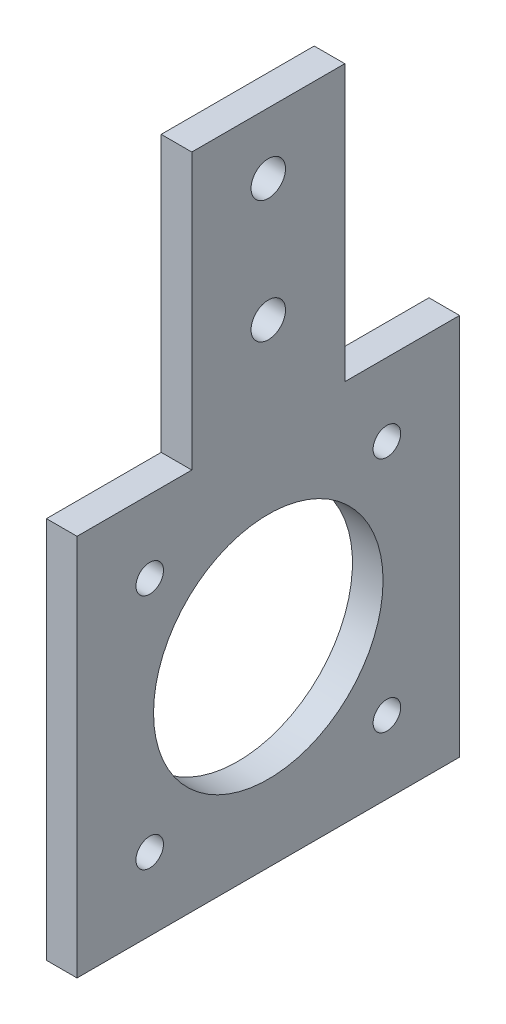
ISO-10303-21;
HEADER;
FILE_DESCRIPTION(('STEP AP214'),'2;1');
FILE_NAME('part.step','',(''),(''),'','','');
FILE_SCHEMA(('AUTOMOTIVE_DESIGN { 1 0 10303 214 1 1 1 1 }'));
ENDSEC;
DATA;
#1=APPLICATION_CONTEXT('core data for automotive mechanical design processes');
#2=APPLICATION_PROTOCOL_DEFINITION('international standard','automotive_design',2000,#1);
#3=PRODUCT_CONTEXT('',#1,'mechanical');
#4=PRODUCT('Part','Part','',(#3));
#5=PRODUCT_RELATED_PRODUCT_CATEGORY('part','',(#4));
#6=PRODUCT_DEFINITION_FORMATION('','',#4);
#7=PRODUCT_DEFINITION_CONTEXT('part definition',#1,'design');
#8=PRODUCT_DEFINITION('design','',#6,#7);
#9=PRODUCT_DEFINITION_SHAPE('','',#8);
#10=(LENGTH_UNIT() NAMED_UNIT(*) SI_UNIT(.MILLI.,.METRE.));
#11=(NAMED_UNIT(*) PLANE_ANGLE_UNIT() SI_UNIT($,.RADIAN.));
#12=(NAMED_UNIT(*) SI_UNIT($,.STERADIAN.) SOLID_ANGLE_UNIT());
#13=UNCERTAINTY_MEASURE_WITH_UNIT(LENGTH_MEASURE(1.E-05),#10,'distance_accuracy_value','');
#14=(GEOMETRIC_REPRESENTATION_CONTEXT(3) GLOBAL_UNCERTAINTY_ASSIGNED_CONTEXT((#13)) GLOBAL_UNIT_ASSIGNED_CONTEXT((#10,
#11,#12)) REPRESENTATION_CONTEXT('',''));
#15=CARTESIAN_POINT('',(0.,0.,0.));
#16=DIRECTION('',(0.,0.,1.));
#17=DIRECTION('',(1.,0.,0.));
#18=AXIS2_PLACEMENT_3D('',#15,#16,#17);
#19=CARTESIAN_POINT('',(-14.,40.,-14.));
#20=DIRECTION('',(1.,0.,0.));
#21=DIRECTION('',(0.,0.,-1.));
#22=AXIS2_PLACEMENT_3D('',#19,#20,#21);
#23=PLANE('',#22);
#24=CARTESIAN_POINT('',(-14.,-5.50021935639087,-15.4997806436091));
#25=DIRECTION('',(-1.,0.,0.));
#26=DIRECTION('',(0.,0.,1.));
#27=AXIS2_PLACEMENT_3D('',#24,#25,#26);
#28=CIRCLE('',#27,1.8);
#29=CARTESIAN_POINT('',(-14.,-5.50021935639087,-13.6997806436091));
#30=VERTEX_POINT('',#29);
#31=EDGE_CURVE('E151',#30,#30,#28,.T.);
#32=ORIENTED_EDGE('',*,*,#31,.F.);
#33=EDGE_LOOP('',(#32));
#34=FACE_BOUND('',#33,.T.);
#35=CARTESIAN_POINT('',(-14.,-5.50021935639087,15.4997806436091));
#36=DIRECTION('',(-1.,0.,0.));
#37=DIRECTION('',(0.,0.,1.));
#38=AXIS2_PLACEMENT_3D('',#35,#36,#37);
#39=CIRCLE('',#38,1.8);
#40=CARTESIAN_POINT('',(-14.,-5.50021935639087,17.2997806436091));
#41=VERTEX_POINT('',#40);
#42=EDGE_CURVE('E156',#41,#41,#39,.T.);
#43=ORIENTED_EDGE('',*,*,#42,.F.);
#44=EDGE_LOOP('',(#43));
#45=FACE_BOUND('',#44,.T.);
#46=CARTESIAN_POINT('',(-14.,-36.4997806436091,15.4997806436091));
#47=DIRECTION('',(-1.,0.,0.));
#48=DIRECTION('',(0.,0.,1.));
#49=AXIS2_PLACEMENT_3D('',#46,#47,#48);
#50=CIRCLE('',#49,1.8);
#51=CARTESIAN_POINT('',(-14.,-36.4997806436091,17.2997806436091));
#52=VERTEX_POINT('',#51);
#53=EDGE_CURVE('E159',#52,#52,#50,.T.);
#54=ORIENTED_EDGE('',*,*,#53,.F.);
#55=EDGE_LOOP('',(#54));
#56=FACE_BOUND('',#55,.T.);
#57=CARTESIAN_POINT('',(-14.,-36.4997806436091,-15.4997806436091));
#58=DIRECTION('',(-1.,0.,0.));
#59=DIRECTION('',(0.,0.,1.));
#60=AXIS2_PLACEMENT_3D('',#57,#58,#59);
#61=CIRCLE('',#60,1.8);
#62=CARTESIAN_POINT('',(-14.,-36.4997806436091,-13.6997806436091));
#63=VERTEX_POINT('',#62);
#64=EDGE_CURVE('E162',#63,#63,#61,.T.);
#65=ORIENTED_EDGE('',*,*,#64,.F.);
#66=EDGE_LOOP('',(#65));
#67=FACE_BOUND('',#66,.T.);
#68=CARTESIAN_POINT('',(-14.,-21.,0.));
#69=DIRECTION('',(-1.,0.,0.));
#70=DIRECTION('',(0.,0.,1.));
#71=AXIS2_PLACEMENT_3D('',#68,#69,#70);
#72=CIRCLE('',#71,15.);
#73=CARTESIAN_POINT('',(-14.,-21.,15.));
#74=VERTEX_POINT('',#73);
#75=EDGE_CURVE('E155',#74,#74,#72,.T.);
#76=ORIENTED_EDGE('',*,*,#75,.F.);
#77=EDGE_LOOP('',(#76));
#78=FACE_BOUND('',#77,.T.);
#79=CARTESIAN_POINT('',(-14.,32.,0.));
#80=DIRECTION('',(-1.,0.,0.));
#81=DIRECTION('',(0.,0.,1.));
#82=AXIS2_PLACEMENT_3D('',#79,#80,#81);
#83=CIRCLE('',#82,2.25);
#84=CARTESIAN_POINT('',(-14.,32.,2.25));
#85=VERTEX_POINT('',#84);
#86=EDGE_CURVE('E180',#85,#85,#83,.T.);
#87=ORIENTED_EDGE('',*,*,#86,.F.);
#88=EDGE_LOOP('',(#87));
#89=FACE_BOUND('',#88,.T.);
#90=CARTESIAN_POINT('',(-14.,16.,0.));
#91=DIRECTION('',(-1.,0.,0.));
#92=DIRECTION('',(0.,0.,1.));
#93=AXIS2_PLACEMENT_3D('',#90,#91,#92);
#94=CIRCLE('',#93,2.25);
#95=CARTESIAN_POINT('',(-14.,16.,2.25));
#96=VERTEX_POINT('',#95);
#97=EDGE_CURVE('E203',#96,#96,#94,.T.);
#98=ORIENTED_EDGE('',*,*,#97,.F.);
#99=EDGE_LOOP('',(#98));
#100=FACE_BOUND('',#99,.T.);
#101=DIRECTION('',(0.,0.,1.));
#102=VECTOR('',#101,1.);
#103=CARTESIAN_POINT('',(-14.,40.,-14.));
#104=LINE('',#103,#102);
#105=CARTESIAN_POINT('',(-14.,40.,-10.));
#106=VERTEX_POINT('',#105);
#107=CARTESIAN_POINT('',(-14.,40.,10.));
#108=VERTEX_POINT('',#107);
#109=EDGE_CURVE('E11',#106,#108,#104,.T.);
#110=ORIENTED_EDGE('',*,*,#109,.F.);
#111=DIRECTION('',(0.,1.,0.));
#112=VECTOR('',#111,1.);
#113=CARTESIAN_POINT('',(-14.,0.,-10.));
#114=LINE('',#113,#112);
#115=CARTESIAN_POINT('',(-14.,4.,-10.));
#116=VERTEX_POINT('',#115);
#117=EDGE_CURVE('E134',#116,#106,#114,.T.);
#118=ORIENTED_EDGE('',*,*,#117,.F.);
#119=DIRECTION('',(0.,0.,1.));
#120=VECTOR('',#119,1.);
#121=CARTESIAN_POINT('',(-14.,4.,0.));
#122=LINE('',#121,#120);
#123=CARTESIAN_POINT('',(-14.,4.,-25.));
#124=VERTEX_POINT('',#123);
#125=EDGE_CURVE('E127',#124,#116,#122,.T.);
#126=ORIENTED_EDGE('',*,*,#125,.F.);
#127=DIRECTION('',(0.,1.,0.));
#128=VECTOR('',#127,1.);
#129=CARTESIAN_POINT('',(-14.,0.,-25.));
#130=LINE('',#129,#128);
#131=CARTESIAN_POINT('',(-14.,-46.,-25.));
#132=VERTEX_POINT('',#131);
#133=EDGE_CURVE('E171',#132,#124,#130,.T.);
#134=ORIENTED_EDGE('',*,*,#133,.F.);
#135=DIRECTION('',(0.,0.,1.));
#136=VECTOR('',#135,1.);
#137=CARTESIAN_POINT('',(-14.,-46.,0.));
#138=LINE('',#137,#136);
#139=CARTESIAN_POINT('',(-14.,-46.,25.));
#140=VERTEX_POINT('',#139);
#141=EDGE_CURVE('E154',#132,#140,#138,.T.);
#142=ORIENTED_EDGE('',*,*,#141,.T.);
#143=DIRECTION('',(0.,1.,0.));
#144=VECTOR('',#143,1.);
#145=CARTESIAN_POINT('',(-14.,0.,25.));
#146=LINE('',#145,#144);
#147=CARTESIAN_POINT('',(-14.,4.,25.));
#148=VERTEX_POINT('',#147);
#149=EDGE_CURVE('E165',#140,#148,#146,.T.);
#150=ORIENTED_EDGE('',*,*,#149,.T.);
#151=CARTESIAN_POINT('',(-14.,4.,10.));
#152=VERTEX_POINT('',#151);
#153=EDGE_CURVE('E139',#152,#148,#122,.T.);
#154=ORIENTED_EDGE('',*,*,#153,.F.);
#155=DIRECTION('',(0.,-1.,0.));
#156=VECTOR('',#155,1.);
#157=CARTESIAN_POINT('',(-14.,0.,10.));
#158=LINE('',#157,#156);
#159=EDGE_CURVE('E145',#108,#152,#158,.T.);
#160=ORIENTED_EDGE('',*,*,#159,.F.);
#161=EDGE_LOOP('',(#110,#118,#126,#134,#142,#150,#154,#160));
#162=FACE_BOUND('',#161,.T.);
#163=ADVANCED_FACE('F42',(#34,#45,#56,#67,#78,#89,#100,#162),#23,.F.);
#164=CARTESIAN_POINT('',(-10.,40.,10.));
#165=DIRECTION('',(1.,0.,0.));
#166=DIRECTION('',(0.,0.,-1.));
#167=AXIS2_PLACEMENT_3D('',#164,#165,#166);
#168=PLANE('',#167);
#169=DIRECTION('',(0.,1.,0.));
#170=VECTOR('',#169,1.);
#171=CARTESIAN_POINT('',(-10.,0.,-10.));
#172=LINE('',#171,#170);
#173=CARTESIAN_POINT('',(-10.,4.,-10.));
#174=VERTEX_POINT('',#173);
#175=CARTESIAN_POINT('',(-10.,40.,-10.));
#176=VERTEX_POINT('',#175);
#177=EDGE_CURVE('E118',#174,#176,#172,.T.);
#178=ORIENTED_EDGE('',*,*,#177,.T.);
#179=DIRECTION('',(0.,0.,1.));
#180=VECTOR('',#179,1.);
#181=CARTESIAN_POINT('',(-10.,40.,10.));
#182=LINE('',#181,#180);
#183=CARTESIAN_POINT('',(-9.99999999999999,40.,10.));
#184=VERTEX_POINT('',#183);
#185=EDGE_CURVE('E50',#176,#184,#182,.T.);
#186=ORIENTED_EDGE('',*,*,#185,.T.);
#187=DIRECTION('',(0.,-1.,0.));
#188=VECTOR('',#187,1.);
#189=CARTESIAN_POINT('',(-9.99999999999999,0.,10.));
#190=LINE('',#189,#188);
#191=CARTESIAN_POINT('',(-9.99999999999999,4.,10.));
#192=VERTEX_POINT('',#191);
#193=EDGE_CURVE('E141',#184,#192,#190,.T.);
#194=ORIENTED_EDGE('',*,*,#193,.T.);
#195=DIRECTION('',(0.,0.,1.));
#196=VECTOR('',#195,1.);
#197=CARTESIAN_POINT('',(-9.99999999999999,4.,0.));
#198=LINE('',#197,#196);
#199=CARTESIAN_POINT('',(-10.,4.,25.));
#200=VERTEX_POINT('',#199);
#201=EDGE_CURVE('E190',#192,#200,#198,.T.);
#202=ORIENTED_EDGE('',*,*,#201,.T.);
#203=DIRECTION('',(0.,1.,0.));
#204=VECTOR('',#203,1.);
#205=CARTESIAN_POINT('',(-10.,0.,25.));
#206=LINE('',#205,#204);
#207=CARTESIAN_POINT('',(-9.99999999999999,-46.,25.));
#208=VERTEX_POINT('',#207);
#209=EDGE_CURVE('E195',#208,#200,#206,.T.);
#210=ORIENTED_EDGE('',*,*,#209,.F.);
#211=DIRECTION('',(0.,0.,1.));
#212=VECTOR('',#211,1.);
#213=CARTESIAN_POINT('',(-9.99999999999999,-46.,0.));
#214=LINE('',#213,#212);
#215=CARTESIAN_POINT('',(-9.99999999999999,-46.,-25.));
#216=VERTEX_POINT('',#215);
#217=EDGE_CURVE('E86',#216,#208,#214,.T.);
#218=ORIENTED_EDGE('',*,*,#217,.F.);
#219=DIRECTION('',(0.,1.,0.));
#220=VECTOR('',#219,1.);
#221=CARTESIAN_POINT('',(-9.99999999999999,0.,-25.));
#222=LINE('',#221,#220);
#223=CARTESIAN_POINT('',(-9.99999999999999,4.,-25.));
#224=VERTEX_POINT('',#223);
#225=EDGE_CURVE('E120',#216,#224,#222,.T.);
#226=ORIENTED_EDGE('',*,*,#225,.T.);
#227=DIRECTION('',(0.,0.,1.));
#228=VECTOR('',#227,1.);
#229=CARTESIAN_POINT('',(-9.99999999999999,4.,0.));
#230=LINE('',#229,#228);
#231=EDGE_CURVE('E64',#224,#174,#230,.T.);
#232=ORIENTED_EDGE('',*,*,#231,.T.);
#233=EDGE_LOOP('',(#178,#186,#194,#202,#210,#218,#226,#232));
#234=FACE_BOUND('',#233,.T.);
#235=CARTESIAN_POINT('',(-9.99999999999999,-36.4997806436091,15.4997806436091));
#236=DIRECTION('',(1.,0.,0.));
#237=DIRECTION('',(0.,0.,-1.));
#238=AXIS2_PLACEMENT_3D('',#235,#236,#237);
#239=CIRCLE('',#238,1.8);
#240=CARTESIAN_POINT('',(-9.99999999999999,-36.4997806436091,13.6997806436091));
#241=VERTEX_POINT('',#240);
#242=EDGE_CURVE('E168',#241,#241,#239,.F.);
#243=ORIENTED_EDGE('',*,*,#242,.T.);
#244=EDGE_LOOP('',(#243));
#245=FACE_BOUND('',#244,.T.);
#246=CARTESIAN_POINT('',(-9.99999999999999,-5.50021935639087,-15.4997806436091));
#247=DIRECTION('',(1.,0.,0.));
#248=DIRECTION('',(0.,0.,-1.));
#249=AXIS2_PLACEMENT_3D('',#246,#247,#248);
#250=CIRCLE('',#249,1.8);
#251=CARTESIAN_POINT('',(-9.99999999999999,-5.50021935639087,-17.2997806436091));
#252=VERTEX_POINT('',#251);
#253=EDGE_CURVE('E121',#252,#252,#250,.F.);
#254=ORIENTED_EDGE('',*,*,#253,.T.);
#255=EDGE_LOOP('',(#254));
#256=FACE_BOUND('',#255,.T.);
#257=CARTESIAN_POINT('',(-9.99999999999999,-21.,0.));
#258=DIRECTION('',(1.,0.,0.));
#259=DIRECTION('',(0.,0.,-1.));
#260=AXIS2_PLACEMENT_3D('',#257,#258,#259);
#261=CIRCLE('',#260,15.);
#262=CARTESIAN_POINT('',(-10.,-21.,-15.));
#263=VERTEX_POINT('',#262);
#264=EDGE_CURVE('E184',#263,#263,#261,.F.);
#265=ORIENTED_EDGE('',*,*,#264,.T.);
#266=EDGE_LOOP('',(#265));
#267=FACE_BOUND('',#266,.T.);
#268=CARTESIAN_POINT('',(-9.99999999999999,-36.4997806436091,-15.4997806436091));
#269=DIRECTION('',(1.,0.,0.));
#270=DIRECTION('',(0.,0.,-1.));
#271=AXIS2_PLACEMENT_3D('',#268,#269,#270);
#272=CIRCLE('',#271,1.8);
#273=CARTESIAN_POINT('',(-9.99999999999999,-36.4997806436091,-17.2997806436091));
#274=VERTEX_POINT('',#273);
#275=EDGE_CURVE('E181',#274,#274,#272,.F.);
#276=ORIENTED_EDGE('',*,*,#275,.T.);
#277=EDGE_LOOP('',(#276));
#278=FACE_BOUND('',#277,.T.);
#279=CARTESIAN_POINT('',(-9.99999999999999,-5.50021935639087,15.4997806436091));
#280=DIRECTION('',(1.,0.,0.));
#281=DIRECTION('',(0.,0.,-1.));
#282=AXIS2_PLACEMENT_3D('',#279,#280,#281);
#283=CIRCLE('',#282,1.8);
#284=CARTESIAN_POINT('',(-9.99999999999999,-5.50021935639087,13.6997806436091));
#285=VERTEX_POINT('',#284);
#286=EDGE_CURVE('E177',#285,#285,#283,.F.);
#287=ORIENTED_EDGE('',*,*,#286,.T.);
#288=EDGE_LOOP('',(#287));
#289=FACE_BOUND('',#288,.T.);
#290=CARTESIAN_POINT('',(-10.,32.,0.));
#291=DIRECTION('',(1.,0.,0.));
#292=DIRECTION('',(0.,0.,-1.));
#293=AXIS2_PLACEMENT_3D('',#290,#291,#292);
#294=CIRCLE('',#293,2.25);
#295=CARTESIAN_POINT('',(-10.,32.,-2.25));
#296=VERTEX_POINT('',#295);
#297=EDGE_CURVE('E206',#296,#296,#294,.T.);
#298=ORIENTED_EDGE('',*,*,#297,.F.);
#299=EDGE_LOOP('',(#298));
#300=FACE_BOUND('',#299,.T.);
#301=CARTESIAN_POINT('',(-10.,16.,0.));
#302=DIRECTION('',(1.,0.,0.));
#303=DIRECTION('',(0.,0.,-1.));
#304=AXIS2_PLACEMENT_3D('',#301,#302,#303);
#305=CIRCLE('',#304,2.25);
#306=CARTESIAN_POINT('',(-10.,16.,-2.25));
#307=VERTEX_POINT('',#306);
#308=EDGE_CURVE('E45',#307,#307,#305,.T.);
#309=ORIENTED_EDGE('',*,*,#308,.F.);
#310=EDGE_LOOP('',(#309));
#311=FACE_BOUND('',#310,.T.);
#312=ADVANCED_FACE('F114',(#234,#245,#256,#267,#278,#289,#300,#311),#168,.T.);
#313=CARTESIAN_POINT('',(0.,40.,0.));
#314=DIRECTION('',(0.,1.,0.));
#315=DIRECTION('',(0.,0.,1.));
#316=AXIS2_PLACEMENT_3D('',#313,#314,#315);
#317=PLANE('',#316);
#318=DIRECTION('',(-1.,0.,0.));
#319=VECTOR('',#318,1.);
#320=CARTESIAN_POINT('',(-10.,40.,-10.));
#321=LINE('',#320,#319);
#322=EDGE_CURVE('E130',#176,#106,#321,.T.);
#323=ORIENTED_EDGE('',*,*,#322,.T.);
#324=ORIENTED_EDGE('',*,*,#109,.T.);
#325=DIRECTION('',(-1.,0.,0.));
#326=VECTOR('',#325,1.);
#327=CARTESIAN_POINT('',(-9.99999999999999,40.,10.));
#328=LINE('',#327,#326);
#329=EDGE_CURVE('E144',#184,#108,#328,.T.);
#330=ORIENTED_EDGE('',*,*,#329,.F.);
#331=ORIENTED_EDGE('',*,*,#185,.F.);
#332=EDGE_LOOP('',(#323,#324,#330,#331));
#333=FACE_BOUND('',#332,.T.);
#334=ADVANCED_FACE('F219',(#333),#317,.T.);
#335=CARTESIAN_POINT('',(16.,32.,0.));
#336=DIRECTION('',(-1.,0.,0.));
#337=DIRECTION('',(0.,0.,1.));
#338=AXIS2_PLACEMENT_3D('',#335,#336,#337);
#339=CYLINDRICAL_SURFACE('',#338,2.25);
#340=ORIENTED_EDGE('',*,*,#297,.T.);
#341=EDGE_LOOP('',(#340));
#342=FACE_BOUND('',#341,.T.);
#343=ORIENTED_EDGE('',*,*,#86,.T.);
#344=EDGE_LOOP('',(#343));
#345=FACE_BOUND('',#344,.T.);
#346=ADVANCED_FACE('F225',(#342,#345),#339,.F.);
#347=CARTESIAN_POINT('',(16.,16.,0.));
#348=DIRECTION('',(-1.,0.,0.));
#349=DIRECTION('',(0.,0.,1.));
#350=AXIS2_PLACEMENT_3D('',#347,#348,#349);
#351=CYLINDRICAL_SURFACE('',#350,2.25);
#352=ORIENTED_EDGE('',*,*,#308,.T.);
#353=EDGE_LOOP('',(#352));
#354=FACE_BOUND('',#353,.T.);
#355=ORIENTED_EDGE('',*,*,#97,.T.);
#356=EDGE_LOOP('',(#355));
#357=FACE_BOUND('',#356,.T.);
#358=ADVANCED_FACE('F215',(#354,#357),#351,.F.);
#359=CARTESIAN_POINT('',(60.7106781186548,4.,0.));
#360=DIRECTION('',(0.,-1.,0.));
#361=DIRECTION('',(0.,0.,-1.));
#362=AXIS2_PLACEMENT_3D('',#359,#360,#361);
#363=PLANE('',#362);
#364=ORIENTED_EDGE('',*,*,#201,.F.);
#365=DIRECTION('',(-1.,0.,0.));
#366=VECTOR('',#365,1.);
#367=CARTESIAN_POINT('',(-9.99999999999999,4.,10.));
#368=LINE('',#367,#366);
#369=EDGE_CURVE('E136',#192,#152,#368,.T.);
#370=ORIENTED_EDGE('',*,*,#369,.T.);
#371=ORIENTED_EDGE('',*,*,#153,.T.);
#372=DIRECTION('',(-1.,0.,0.));
#373=VECTOR('',#372,1.);
#374=CARTESIAN_POINT('',(60.7106781186548,4.,25.));
#375=LINE('',#374,#373);
#376=EDGE_CURVE('E194',#200,#148,#375,.T.);
#377=ORIENTED_EDGE('',*,*,#376,.F.);
#378=EDGE_LOOP('',(#364,#370,#371,#377));
#379=FACE_BOUND('',#378,.T.);
#380=ADVANCED_FACE('F233',(#379),#363,.F.);
#381=CARTESIAN_POINT('',(60.7106781186548,0.,25.));
#382=DIRECTION('',(0.,0.,1.));
#383=DIRECTION('',(1.,0.,0.));
#384=AXIS2_PLACEMENT_3D('',#381,#382,#383);
#385=PLANE('',#384);
#386=DIRECTION('',(-1.,0.,0.));
#387=VECTOR('',#386,1.);
#388=CARTESIAN_POINT('',(60.7106781186548,-46.,25.));
#389=LINE('',#388,#387);
#390=EDGE_CURVE('E81',#208,#140,#389,.T.);
#391=ORIENTED_EDGE('',*,*,#390,.F.);
#392=ORIENTED_EDGE('',*,*,#209,.T.);
#393=ORIENTED_EDGE('',*,*,#376,.T.);
#394=ORIENTED_EDGE('',*,*,#149,.F.);
#395=EDGE_LOOP('',(#391,#392,#393,#394));
#396=FACE_BOUND('',#395,.T.);
#397=ADVANCED_FACE('F243',(#396),#385,.T.);
#398=CARTESIAN_POINT('',(60.7106781186548,-46.,0.));
#399=DIRECTION('',(0.,-1.,0.));
#400=DIRECTION('',(0.,0.,-1.));
#401=AXIS2_PLACEMENT_3D('',#398,#399,#400);
#402=PLANE('',#401);
#403=DIRECTION('',(-1.,0.,0.));
#404=VECTOR('',#403,1.);
#405=CARTESIAN_POINT('',(60.7106781186548,-46.,-25.));
#406=LINE('',#405,#404);
#407=EDGE_CURVE('E173',#216,#132,#406,.T.);
#408=ORIENTED_EDGE('',*,*,#407,.F.);
#409=ORIENTED_EDGE('',*,*,#217,.T.);
#410=ORIENTED_EDGE('',*,*,#390,.T.);
#411=ORIENTED_EDGE('',*,*,#141,.F.);
#412=EDGE_LOOP('',(#408,#409,#410,#411));
#413=FACE_BOUND('',#412,.T.);
#414=ADVANCED_FACE('F246',(#413),#402,.T.);
#415=CARTESIAN_POINT('',(60.7106781186548,0.,-25.));
#416=DIRECTION('',(0.,0.,1.));
#417=DIRECTION('',(0.,-1.,0.));
#418=AXIS2_PLACEMENT_3D('',#415,#416,#417);
#419=PLANE('',#418);
#420=ORIENTED_EDGE('',*,*,#225,.F.);
#421=ORIENTED_EDGE('',*,*,#407,.T.);
#422=ORIENTED_EDGE('',*,*,#133,.T.);
#423=DIRECTION('',(-1.,0.,0.));
#424=VECTOR('',#423,1.);
#425=CARTESIAN_POINT('',(60.7106781186548,4.,-25.));
#426=LINE('',#425,#424);
#427=EDGE_CURVE('E58',#224,#124,#426,.T.);
#428=ORIENTED_EDGE('',*,*,#427,.F.);
#429=EDGE_LOOP('',(#420,#421,#422,#428));
#430=FACE_BOUND('',#429,.T.);
#431=ADVANCED_FACE('F250',(#430),#419,.F.);
#432=ORIENTED_EDGE('',*,*,#231,.F.);
#433=ORIENTED_EDGE('',*,*,#427,.T.);
#434=ORIENTED_EDGE('',*,*,#125,.T.);
#435=DIRECTION('',(-1.,0.,0.));
#436=VECTOR('',#435,1.);
#437=CARTESIAN_POINT('',(-10.,4.,-10.));
#438=LINE('',#437,#436);
#439=EDGE_CURVE('E124',#174,#116,#438,.T.);
#440=ORIENTED_EDGE('',*,*,#439,.F.);
#441=EDGE_LOOP('',(#432,#433,#434,#440));
#442=FACE_BOUND('',#441,.T.);
#443=ADVANCED_FACE('F125',(#442),#363,.F.);
#444=CARTESIAN_POINT('',(60.7106781186548,-5.50021935639087,15.4997806436091));
#445=DIRECTION('',(-1.,0.,0.));
#446=DIRECTION('',(0.,0.,1.));
#447=AXIS2_PLACEMENT_3D('',#444,#445,#446);
#448=CYLINDRICAL_SURFACE('',#447,1.8);
#449=ORIENTED_EDGE('',*,*,#42,.T.);
#450=EDGE_LOOP('',(#449));
#451=FACE_BOUND('',#450,.T.);
#452=ORIENTED_EDGE('',*,*,#286,.F.);
#453=EDGE_LOOP('',(#452));
#454=FACE_BOUND('',#453,.T.);
#455=ADVANCED_FACE('F263',(#451,#454),#448,.F.);
#456=CARTESIAN_POINT('',(60.7106781186548,-36.4997806436091,15.4997806436091));
#457=DIRECTION('',(-1.,0.,0.));
#458=DIRECTION('',(0.,0.,1.));
#459=AXIS2_PLACEMENT_3D('',#456,#457,#458);
#460=CYLINDRICAL_SURFACE('',#459,1.8);
#461=ORIENTED_EDGE('',*,*,#53,.T.);
#462=EDGE_LOOP('',(#461));
#463=FACE_BOUND('',#462,.T.);
#464=ORIENTED_EDGE('',*,*,#242,.F.);
#465=EDGE_LOOP('',(#464));
#466=FACE_BOUND('',#465,.T.);
#467=ADVANCED_FACE('F259',(#463,#466),#460,.F.);
#468=CARTESIAN_POINT('',(60.7106781186548,-36.4997806436091,-15.4997806436091));
#469=DIRECTION('',(-1.,0.,0.));
#470=DIRECTION('',(0.,0.,1.));
#471=AXIS2_PLACEMENT_3D('',#468,#469,#470);
#472=CYLINDRICAL_SURFACE('',#471,1.8);
#473=ORIENTED_EDGE('',*,*,#64,.T.);
#474=EDGE_LOOP('',(#473));
#475=FACE_BOUND('',#474,.T.);
#476=ORIENTED_EDGE('',*,*,#275,.F.);
#477=EDGE_LOOP('',(#476));
#478=FACE_BOUND('',#477,.T.);
#479=ADVANCED_FACE('F241',(#475,#478),#472,.F.);
#480=CARTESIAN_POINT('',(60.7106781186548,-21.,0.));
#481=DIRECTION('',(-1.,0.,0.));
#482=DIRECTION('',(0.,0.,1.));
#483=AXIS2_PLACEMENT_3D('',#480,#481,#482);
#484=CYLINDRICAL_SURFACE('',#483,15.);
#485=ORIENTED_EDGE('',*,*,#75,.T.);
#486=EDGE_LOOP('',(#485));
#487=FACE_BOUND('',#486,.T.);
#488=ORIENTED_EDGE('',*,*,#264,.F.);
#489=EDGE_LOOP('',(#488));
#490=FACE_BOUND('',#489,.T.);
#491=ADVANCED_FACE('F237',(#487,#490),#484,.F.);
#492=CARTESIAN_POINT('',(60.7106781186548,-5.50021935639087,-15.4997806436091));
#493=DIRECTION('',(-1.,0.,0.));
#494=DIRECTION('',(0.,0.,1.));
#495=AXIS2_PLACEMENT_3D('',#492,#493,#494);
#496=CYLINDRICAL_SURFACE('',#495,1.8);
#497=ORIENTED_EDGE('',*,*,#31,.T.);
#498=EDGE_LOOP('',(#497));
#499=FACE_BOUND('',#498,.T.);
#500=ORIENTED_EDGE('',*,*,#253,.F.);
#501=EDGE_LOOP('',(#500));
#502=FACE_BOUND('',#501,.T.);
#503=ADVANCED_FACE('F234',(#499,#502),#496,.F.);
#504=CARTESIAN_POINT('',(-10.,0.,-10.));
#505=DIRECTION('',(0.,0.,1.));
#506=DIRECTION('',(1.,0.,0.));
#507=AXIS2_PLACEMENT_3D('',#504,#505,#506);
#508=PLANE('',#507);
#509=ORIENTED_EDGE('',*,*,#117,.T.);
#510=ORIENTED_EDGE('',*,*,#322,.F.);
#511=ORIENTED_EDGE('',*,*,#177,.F.);
#512=ORIENTED_EDGE('',*,*,#439,.T.);
#513=EDGE_LOOP('',(#509,#510,#511,#512));
#514=FACE_BOUND('',#513,.T.);
#515=ADVANCED_FACE('F132',(#514),#508,.F.);
#516=CARTESIAN_POINT('',(-9.99999999999999,0.,10.));
#517=DIRECTION('',(0.,0.,-1.));
#518=DIRECTION('',(0.,1.,0.));
#519=AXIS2_PLACEMENT_3D('',#516,#517,#518);
#520=PLANE('',#519);
#521=ORIENTED_EDGE('',*,*,#159,.T.);
#522=ORIENTED_EDGE('',*,*,#369,.F.);
#523=ORIENTED_EDGE('',*,*,#193,.F.);
#524=ORIENTED_EDGE('',*,*,#329,.T.);
#525=EDGE_LOOP('',(#521,#522,#523,#524));
#526=FACE_BOUND('',#525,.T.);
#527=ADVANCED_FACE('F268',(#526),#520,.F.);
#528=CLOSED_SHELL('',(#163,#312,#334,#346,#358,#380,#397,#414,#431,#443,#455,#467,#479,#491,
#503,#515,#527));
#529=MANIFOLD_SOLID_BREP('B2',#528);
#530=ADVANCED_BREP_SHAPE_REPRESENTATION('',(#18,#529),#14);
#531=SHAPE_DEFINITION_REPRESENTATION(#9,#530);
ENDSEC;
END-ISO-10303-21;
